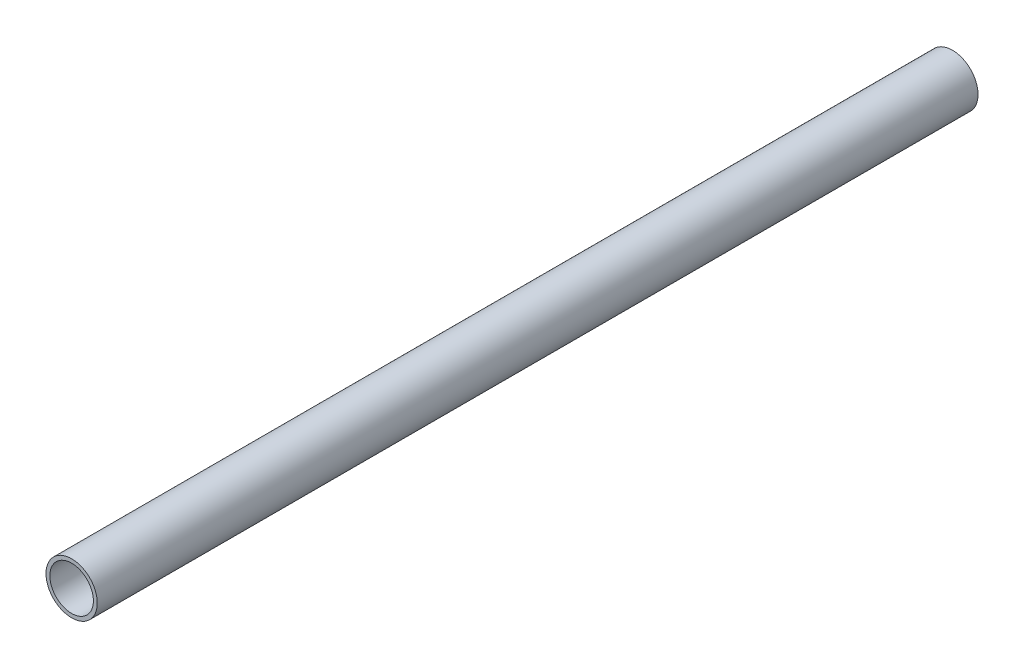
ISO-10303-21;
HEADER;
FILE_DESCRIPTION(('STEP AP214'),'2;1');
FILE_NAME('part.step','',(''),(''),'','','');
FILE_SCHEMA(('AUTOMOTIVE_DESIGN { 1 0 10303 214 1 1 1 1 }'));
ENDSEC;
DATA;
#1=APPLICATION_CONTEXT('core data for automotive mechanical design processes');
#2=APPLICATION_PROTOCOL_DEFINITION('international standard','automotive_design',2000,#1);
#3=PRODUCT_CONTEXT('',#1,'mechanical');
#4=PRODUCT('Part','Part','',(#3));
#5=PRODUCT_RELATED_PRODUCT_CATEGORY('part','',(#4));
#6=PRODUCT_DEFINITION_FORMATION('','',#4);
#7=PRODUCT_DEFINITION_CONTEXT('part definition',#1,'design');
#8=PRODUCT_DEFINITION('design','',#6,#7);
#9=PRODUCT_DEFINITION_SHAPE('','',#8);
#10=(LENGTH_UNIT() NAMED_UNIT(*) SI_UNIT(.MILLI.,.METRE.));
#11=(NAMED_UNIT(*) PLANE_ANGLE_UNIT() SI_UNIT($,.RADIAN.));
#12=(NAMED_UNIT(*) SI_UNIT($,.STERADIAN.) SOLID_ANGLE_UNIT());
#13=UNCERTAINTY_MEASURE_WITH_UNIT(LENGTH_MEASURE(1.E-05),#10,'distance_accuracy_value','');
#14=(GEOMETRIC_REPRESENTATION_CONTEXT(3) GLOBAL_UNCERTAINTY_ASSIGNED_CONTEXT((#13)) GLOBAL_UNIT_ASSIGNED_CONTEXT((#10,
#11,#12)) REPRESENTATION_CONTEXT('',''));
#15=CARTESIAN_POINT('',(0.,0.,0.));
#16=DIRECTION('',(0.,0.,1.));
#17=DIRECTION('',(1.,0.,0.));
#18=AXIS2_PLACEMENT_3D('',#15,#16,#17);
#19=CARTESIAN_POINT('',(0.,0.,0.));
#20=DIRECTION('',(0.,0.,1.));
#21=DIRECTION('',(1.,0.,0.));
#22=AXIS2_PLACEMENT_3D('',#19,#20,#21);
#23=PLANE('',#22);
#24=CARTESIAN_POINT('',(0.,0.,0.));
#25=DIRECTION('',(0.,0.,-1.));
#26=DIRECTION('',(1.,0.,0.));
#27=AXIS2_PLACEMENT_3D('',#24,#25,#26);
#28=CIRCLE('',#27,6.8);
#29=CARTESIAN_POINT('',(-6.8,0.,0.));
#30=VERTEX_POINT('',#29);
#31=EDGE_CURVE('E53',#30,#30,#28,.T.);
#32=ORIENTED_EDGE('',*,*,#31,.F.);
#33=EDGE_LOOP('',(#32));
#34=FACE_BOUND('',#33,.T.);
#35=CARTESIAN_POINT('',(0.,0.,0.));
#36=DIRECTION('',(0.,0.,1.));
#37=DIRECTION('',(1.,0.,0.));
#38=AXIS2_PLACEMENT_3D('',#35,#36,#37);
#39=CIRCLE('',#38,8.);
#40=CARTESIAN_POINT('',(-8.,0.,0.));
#41=VERTEX_POINT('',#40);
#42=EDGE_CURVE('E11',#41,#41,#39,.T.);
#43=ORIENTED_EDGE('',*,*,#42,.F.);
#44=EDGE_LOOP('',(#43));
#45=FACE_BOUND('',#44,.T.);
#46=ADVANCED_FACE('F16',(#34,#45),#23,.F.);
#47=CARTESIAN_POINT('',(0.,0.,275.));
#48=DIRECTION('',(0.,0.,1.));
#49=DIRECTION('',(1.,0.,0.));
#50=AXIS2_PLACEMENT_3D('',#47,#48,#49);
#51=PLANE('',#50);
#52=CARTESIAN_POINT('',(0.,0.,275.));
#53=DIRECTION('',(0.,0.,-1.));
#54=DIRECTION('',(1.,0.,0.));
#55=AXIS2_PLACEMENT_3D('',#52,#53,#54);
#56=CIRCLE('',#55,6.8);
#57=CARTESIAN_POINT('',(-6.8,0.,275.));
#58=VERTEX_POINT('',#57);
#59=EDGE_CURVE('E65',#58,#58,#56,.T.);
#60=ORIENTED_EDGE('',*,*,#59,.T.);
#61=EDGE_LOOP('',(#60));
#62=FACE_BOUND('',#61,.T.);
#63=CARTESIAN_POINT('',(0.,0.,275.));
#64=DIRECTION('',(0.,0.,1.));
#65=DIRECTION('',(1.,0.,0.));
#66=AXIS2_PLACEMENT_3D('',#63,#64,#65);
#67=CIRCLE('',#66,8.);
#68=CARTESIAN_POINT('',(-8.,0.,275.));
#69=VERTEX_POINT('',#68);
#70=EDGE_CURVE('E57',#69,#69,#67,.T.);
#71=ORIENTED_EDGE('',*,*,#70,.T.);
#72=EDGE_LOOP('',(#71));
#73=FACE_BOUND('',#72,.T.);
#74=ADVANCED_FACE('F18',(#62,#73),#51,.T.);
#75=CARTESIAN_POINT('',(0.,0.,0.));
#76=DIRECTION('',(0.,0.,1.));
#77=DIRECTION('',(1.,0.,0.));
#78=AXIS2_PLACEMENT_3D('',#75,#76,#77);
#79=CYLINDRICAL_SURFACE('',#78,8.);
#80=ORIENTED_EDGE('',*,*,#70,.F.);
#81=DIRECTION('',(0.,0.,-1.));
#82=VECTOR('',#81,1.);
#83=CARTESIAN_POINT('',(-8.,0.,0.));
#84=LINE('',#83,#82);
#85=EDGE_CURVE('E20',#69,#41,#84,.T.);
#86=ORIENTED_EDGE('',*,*,#85,.T.);
#87=ORIENTED_EDGE('',*,*,#42,.T.);
#88=ORIENTED_EDGE('',*,*,#85,.F.);
#89=EDGE_LOOP('',(#80,#86,#87,#88));
#90=FACE_BOUND('',#89,.T.);
#91=ADVANCED_FACE('F74',(#90),#79,.T.);
#92=CARTESIAN_POINT('',(0.,0.,0.));
#93=DIRECTION('',(0.,0.,1.));
#94=DIRECTION('',(1.,0.,0.));
#95=AXIS2_PLACEMENT_3D('',#92,#93,#94);
#96=CYLINDRICAL_SURFACE('',#95,6.8);
#97=ORIENTED_EDGE('',*,*,#59,.F.);
#98=DIRECTION('',(0.,0.,-1.));
#99=VECTOR('',#98,1.);
#100=CARTESIAN_POINT('',(-6.8,0.,0.));
#101=LINE('',#100,#99);
#102=EDGE_CURVE('E48',#58,#30,#101,.T.);
#103=ORIENTED_EDGE('',*,*,#102,.T.);
#104=ORIENTED_EDGE('',*,*,#31,.T.);
#105=ORIENTED_EDGE('',*,*,#102,.F.);
#106=EDGE_LOOP('',(#97,#103,#104,#105));
#107=FACE_BOUND('',#106,.T.);
#108=ADVANCED_FACE('F54',(#107),#96,.F.);
#109=CLOSED_SHELL('',(#46,#74,#91,#108));
#110=MANIFOLD_SOLID_BREP('B1',#109);
#111=ADVANCED_BREP_SHAPE_REPRESENTATION('',(#18,#110),#14);
#112=SHAPE_DEFINITION_REPRESENTATION(#9,#111);
ENDSEC;
END-ISO-10303-21;
